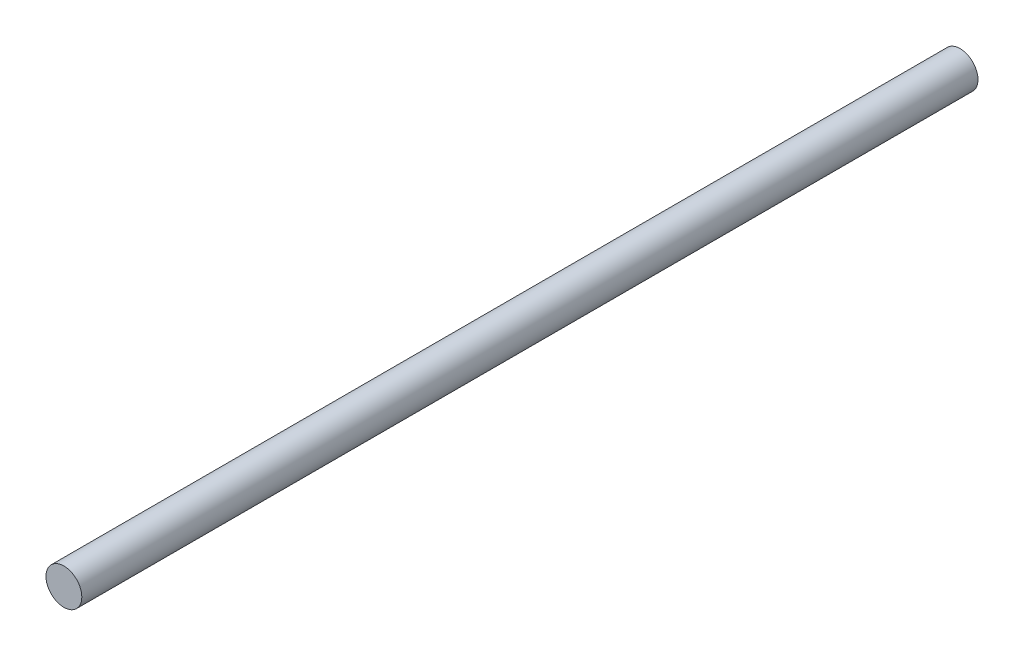
ISO-10303-21;
HEADER;
FILE_DESCRIPTION(('STEP AP214'),'2;1');
FILE_NAME('part.step','',(''),(''),'','','');
FILE_SCHEMA(('AUTOMOTIVE_DESIGN { 1 0 10303 214 1 1 1 1 }'));
ENDSEC;
DATA;
#1=APPLICATION_CONTEXT('core data for automotive mechanical design processes');
#2=APPLICATION_PROTOCOL_DEFINITION('international standard','automotive_design',2000,#1);
#3=PRODUCT_CONTEXT('',#1,'mechanical');
#4=PRODUCT('Part','Part','',(#3));
#5=PRODUCT_RELATED_PRODUCT_CATEGORY('part','',(#4));
#6=PRODUCT_DEFINITION_FORMATION('','',#4);
#7=PRODUCT_DEFINITION_CONTEXT('part definition',#1,'design');
#8=PRODUCT_DEFINITION('design','',#6,#7);
#9=PRODUCT_DEFINITION_SHAPE('','',#8);
#10=(LENGTH_UNIT() NAMED_UNIT(*) SI_UNIT(.MILLI.,.METRE.));
#11=(NAMED_UNIT(*) PLANE_ANGLE_UNIT() SI_UNIT($,.RADIAN.));
#12=(NAMED_UNIT(*) SI_UNIT($,.STERADIAN.) SOLID_ANGLE_UNIT());
#13=UNCERTAINTY_MEASURE_WITH_UNIT(LENGTH_MEASURE(1.E-05),#10,'distance_accuracy_value','');
#14=(GEOMETRIC_REPRESENTATION_CONTEXT(3) GLOBAL_UNCERTAINTY_ASSIGNED_CONTEXT((#13)) GLOBAL_UNIT_ASSIGNED_CONTEXT((#10,
#11,#12)) REPRESENTATION_CONTEXT('',''));
#15=CARTESIAN_POINT('',(0.,0.,0.));
#16=DIRECTION('',(0.,0.,1.));
#17=DIRECTION('',(1.,0.,0.));
#18=AXIS2_PLACEMENT_3D('',#15,#16,#17);
#19=CARTESIAN_POINT('',(0.,0.,75.));
#20=DIRECTION('',(0.,0.,-1.));
#21=DIRECTION('',(-1.,0.,0.));
#22=AXIS2_PLACEMENT_3D('',#19,#20,#21);
#23=CYLINDRICAL_SURFACE('',#22,3.);
#24=CARTESIAN_POINT('',(0.,0.,75.));
#25=DIRECTION('',(0.,0.,1.));
#26=DIRECTION('',(1.,0.,0.));
#27=AXIS2_PLACEMENT_3D('',#24,#25,#26);
#28=CIRCLE('',#27,3.);
#29=CARTESIAN_POINT('',(3.,0.,75.));
#30=VERTEX_POINT('',#29);
#31=EDGE_CURVE('E10',#30,#30,#28,.T.);
#32=ORIENTED_EDGE('',*,*,#31,.F.);
#33=EDGE_LOOP('',(#32));
#34=FACE_BOUND('',#33,.T.);
#35=CARTESIAN_POINT('',(0.,0.,-75.));
#36=DIRECTION('',(0.,0.,1.));
#37=DIRECTION('',(1.,0.,0.));
#38=AXIS2_PLACEMENT_3D('',#35,#36,#37);
#39=CIRCLE('',#38,3.);
#40=CARTESIAN_POINT('',(3.,0.,-75.));
#41=VERTEX_POINT('',#40);
#42=EDGE_CURVE('E35',#41,#41,#39,.T.);
#43=ORIENTED_EDGE('',*,*,#42,.T.);
#44=EDGE_LOOP('',(#43));
#45=FACE_BOUND('',#44,.T.);
#46=ADVANCED_FACE('F32',(#34,#45),#23,.T.);
#47=CARTESIAN_POINT('',(0.,0.,75.));
#48=DIRECTION('',(0.,0.,1.));
#49=DIRECTION('',(1.,0.,0.));
#50=AXIS2_PLACEMENT_3D('',#47,#48,#49);
#51=PLANE('',#50);
#52=ORIENTED_EDGE('',*,*,#31,.T.);
#53=EDGE_LOOP('',(#52));
#54=FACE_BOUND('',#53,.T.);
#55=ADVANCED_FACE('F47',(#54),#51,.T.);
#56=CARTESIAN_POINT('',(0.,0.,-75.));
#57=DIRECTION('',(0.,0.,1.));
#58=DIRECTION('',(1.,0.,0.));
#59=AXIS2_PLACEMENT_3D('',#56,#57,#58);
#60=PLANE('',#59);
#61=ORIENTED_EDGE('',*,*,#42,.F.);
#62=EDGE_LOOP('',(#61));
#63=FACE_BOUND('',#62,.T.);
#64=ADVANCED_FACE('F45',(#63),#60,.F.);
#65=CLOSED_SHELL('',(#46,#55,#64));
#66=MANIFOLD_SOLID_BREP('B2',#65);
#67=ADVANCED_BREP_SHAPE_REPRESENTATION('',(#18,#66),#14);
#68=SHAPE_DEFINITION_REPRESENTATION(#9,#67);
ENDSEC;
END-ISO-10303-21;
